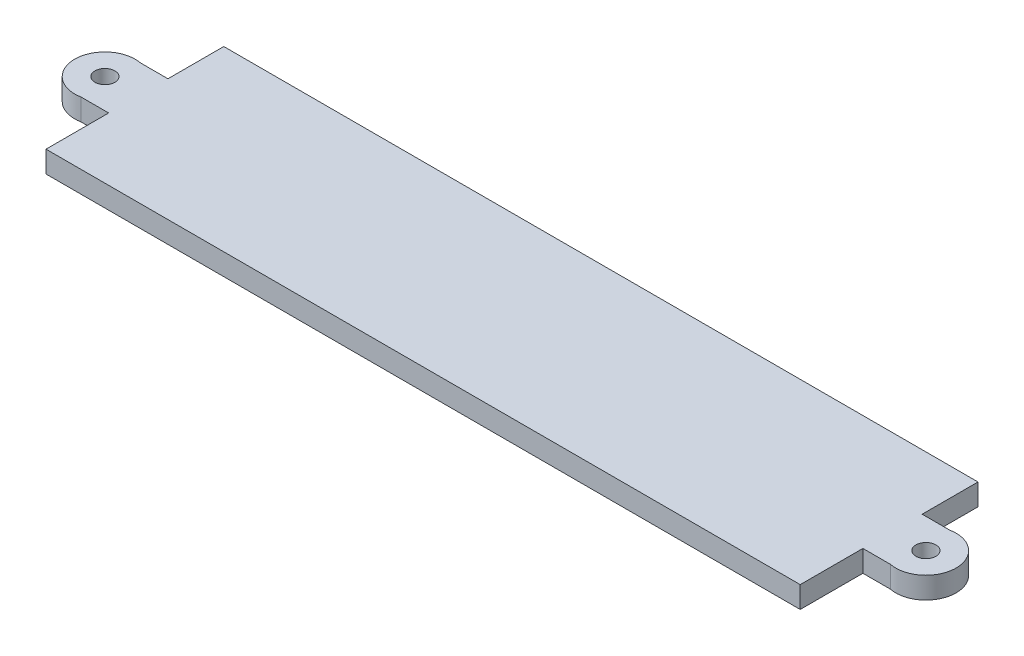
ISO-10303-21;
HEADER;
FILE_DESCRIPTION(('STEP AP214'),'2;1');
FILE_NAME('part.step','',(''),(''),'','','');
FILE_SCHEMA(('AUTOMOTIVE_DESIGN { 1 0 10303 214 1 1 1 1 }'));
ENDSEC;
DATA;
#1=APPLICATION_CONTEXT('core data for automotive mechanical design processes');
#2=APPLICATION_PROTOCOL_DEFINITION('international standard','automotive_design',2000,#1);
#3=PRODUCT_CONTEXT('',#1,'mechanical');
#4=PRODUCT('Part','Part','',(#3));
#5=PRODUCT_RELATED_PRODUCT_CATEGORY('part','',(#4));
#6=PRODUCT_DEFINITION_FORMATION('','',#4);
#7=PRODUCT_DEFINITION_CONTEXT('part definition',#1,'design');
#8=PRODUCT_DEFINITION('design','',#6,#7);
#9=PRODUCT_DEFINITION_SHAPE('','',#8);
#10=(LENGTH_UNIT() NAMED_UNIT(*) SI_UNIT(.MILLI.,.METRE.));
#11=(NAMED_UNIT(*) PLANE_ANGLE_UNIT() SI_UNIT($,.RADIAN.));
#12=(NAMED_UNIT(*) SI_UNIT($,.STERADIAN.) SOLID_ANGLE_UNIT());
#13=UNCERTAINTY_MEASURE_WITH_UNIT(LENGTH_MEASURE(1.E-05),#10,'distance_accuracy_value','');
#14=(GEOMETRIC_REPRESENTATION_CONTEXT(3) GLOBAL_UNCERTAINTY_ASSIGNED_CONTEXT((#13)) GLOBAL_UNIT_ASSIGNED_CONTEXT((#10,
#11,#12)) REPRESENTATION_CONTEXT('',''));
#15=CARTESIAN_POINT('',(0.,0.,0.));
#16=DIRECTION('',(0.,0.,1.));
#17=DIRECTION('',(1.,0.,0.));
#18=AXIS2_PLACEMENT_3D('',#15,#16,#17);
#19=CARTESIAN_POINT('',(0.,5.08,0.));
#20=DIRECTION('',(0.,1.,0.));
#21=DIRECTION('',(0.,0.,1.));
#22=AXIS2_PLACEMENT_3D('',#19,#20,#21);
#23=PLANE('',#22);
#24=CARTESIAN_POINT('',(-78.8273641130957,5.08,8.10690245487701));
#25=DIRECTION('',(0.,1.,0.));
#26=DIRECTION('',(0.,0.,1.));
#27=AXIS2_PLACEMENT_3D('',#24,#25,#26);
#28=CIRCLE('',#27,7.12110493309916);
#29=CARTESIAN_POINT('',(-77.4417557744194,5.08,1.12190245487701));
#30=VERTEX_POINT('',#29);
#31=CARTESIAN_POINT('',(-77.4417557744194,5.08,15.091902454877));
#32=VERTEX_POINT('',#31);
#33=EDGE_CURVE('E83',#30,#32,#28,.T.);
#34=ORIENTED_EDGE('',*,*,#33,.T.);
#35=DIRECTION('',(-1.,0.,0.));
#36=VECTOR('',#35,1.);
#37=CARTESIAN_POINT('',(0.,5.08,15.091902454877));
#38=LINE('',#37,#36);
#39=CARTESIAN_POINT('',(-70.9533641130957,5.08,15.091902454877));
#40=VERTEX_POINT('',#39);
#41=EDGE_CURVE('E128',#40,#32,#38,.T.);
#42=ORIENTED_EDGE('',*,*,#41,.F.);
#43=DIRECTION('',(0.,0.,-1.));
#44=VECTOR('',#43,1.);
#45=CARTESIAN_POINT('',(-70.9533641130957,5.08,0.));
#46=LINE('',#45,#44);
#47=CARTESIAN_POINT('',(-70.9533641130957,5.08,29.8660279689433));
#48=VERTEX_POINT('',#47);
#49=EDGE_CURVE('E122',#48,#40,#46,.T.);
#50=ORIENTED_EDGE('',*,*,#49,.F.);
#51=DIRECTION('',(1.,0.,0.));
#52=VECTOR('',#51,1.);
#53=CARTESIAN_POINT('',(0.,5.08,29.8660279689433));
#54=LINE('',#53,#52);
#55=CARTESIAN_POINT('',(106.846635886904,5.08,29.8660279689433));
#56=VERTEX_POINT('',#55);
#57=EDGE_CURVE('E118',#48,#56,#54,.T.);
#58=ORIENTED_EDGE('',*,*,#57,.T.);
#59=DIRECTION('',(0.,0.,-1.));
#60=VECTOR('',#59,1.);
#61=CARTESIAN_POINT('',(106.846635886904,5.08,0.));
#62=LINE('',#61,#60);
#63=CARTESIAN_POINT('',(106.846635886904,5.08,15.091902454877));
#64=VERTEX_POINT('',#63);
#65=EDGE_CURVE('E178',#56,#64,#62,.T.);
#66=ORIENTED_EDGE('',*,*,#65,.T.);
#67=DIRECTION('',(1.,0.,0.));
#68=VECTOR('',#67,1.);
#69=CARTESIAN_POINT('',(35.8932717738087,5.08,15.091902454877));
#70=LINE('',#69,#68);
#71=CARTESIAN_POINT('',(113.335027548228,5.08,15.091902454877));
#72=VERTEX_POINT('',#71);
#73=EDGE_CURVE('E160',#64,#72,#70,.T.);
#74=ORIENTED_EDGE('',*,*,#73,.T.);
#75=CARTESIAN_POINT('',(114.720635886904,5.08,8.106902454877));
#76=DIRECTION('',(0.,-1.,0.));
#77=DIRECTION('',(0.,0.,1.));
#78=AXIS2_PLACEMENT_3D('',#75,#76,#77);
#79=CIRCLE('',#78,7.12110493309916);
#80=CARTESIAN_POINT('',(113.335027548228,5.08,1.121902454877));
#81=VERTEX_POINT('',#80);
#82=EDGE_CURVE('E164',#81,#72,#79,.T.);
#83=ORIENTED_EDGE('',*,*,#82,.F.);
#84=DIRECTION('',(1.,0.,0.));
#85=VECTOR('',#84,1.);
#86=CARTESIAN_POINT('',(35.8932717738087,5.08,1.121902454877));
#87=LINE('',#86,#85);
#88=CARTESIAN_POINT('',(106.846635886904,5.08,1.121902454877));
#89=VERTEX_POINT('',#88);
#90=EDGE_CURVE('E180',#89,#81,#87,.T.);
#91=ORIENTED_EDGE('',*,*,#90,.F.);
#92=CARTESIAN_POINT('',(106.846635886904,5.08,-12.0439720310567));
#93=VERTEX_POINT('',#92);
#94=EDGE_CURVE('E116',#89,#93,#62,.T.);
#95=ORIENTED_EDGE('',*,*,#94,.T.);
#96=DIRECTION('',(1.,0.,0.));
#97=VECTOR('',#96,1.);
#98=CARTESIAN_POINT('',(0.,5.08,-12.0439720310567));
#99=LINE('',#98,#97);
#100=CARTESIAN_POINT('',(-70.9533641130957,5.08,-12.0439720310567));
#101=VERTEX_POINT('',#100);
#102=EDGE_CURVE('E102',#101,#93,#99,.T.);
#103=ORIENTED_EDGE('',*,*,#102,.F.);
#104=CARTESIAN_POINT('',(-70.9533641130957,5.08,1.12190245487701));
#105=VERTEX_POINT('',#104);
#106=EDGE_CURVE('E113',#105,#101,#46,.T.);
#107=ORIENTED_EDGE('',*,*,#106,.F.);
#108=DIRECTION('',(-1.,0.,0.));
#109=VECTOR('',#108,1.);
#110=CARTESIAN_POINT('',(0.,5.08,1.121902454877));
#111=LINE('',#110,#109);
#112=EDGE_CURVE('E52',#105,#30,#111,.T.);
#113=ORIENTED_EDGE('',*,*,#112,.T.);
#114=EDGE_LOOP('',(#34,#42,#50,#58,#66,#74,#83,#91,#95,#103,#107,#113));
#115=FACE_BOUND('',#114,.T.);
#116=CARTESIAN_POINT('',(-78.8273641130957,5.08,8.10690245487701));
#117=DIRECTION('',(0.,1.,0.));
#118=DIRECTION('',(0.,0.,1.));
#119=AXIS2_PLACEMENT_3D('',#116,#117,#118);
#120=CIRCLE('',#119,2.3495);
#121=CARTESIAN_POINT('',(-78.8273641130957,5.08,10.456402454877));
#122=VERTEX_POINT('',#121);
#123=EDGE_CURVE('E136',#122,#122,#120,.F.);
#124=ORIENTED_EDGE('',*,*,#123,.T.);
#125=EDGE_LOOP('',(#124));
#126=FACE_BOUND('',#125,.T.);
#127=CARTESIAN_POINT('',(114.720635886904,5.08,8.106902454877));
#128=DIRECTION('',(0.,1.,0.));
#129=DIRECTION('',(0.,0.,1.));
#130=AXIS2_PLACEMENT_3D('',#127,#128,#129);
#131=CIRCLE('',#130,2.3495);
#132=CARTESIAN_POINT('',(114.720635886904,5.08,10.456402454877));
#133=VERTEX_POINT('',#132);
#134=EDGE_CURVE('E175',#133,#133,#131,.T.);
#135=ORIENTED_EDGE('',*,*,#134,.F.);
#136=EDGE_LOOP('',(#135));
#137=FACE_BOUND('',#136,.T.);
#138=ADVANCED_FACE('F35',(#115,#126,#137),#23,.T.);
#139=CARTESIAN_POINT('',(0.,0.,0.));
#140=DIRECTION('',(0.,1.,0.));
#141=DIRECTION('',(0.,0.,1.));
#142=AXIS2_PLACEMENT_3D('',#139,#140,#141);
#143=PLANE('',#142);
#144=CARTESIAN_POINT('',(-78.8273641130957,0.,8.10690245487701));
#145=DIRECTION('',(0.,1.,0.));
#146=DIRECTION('',(0.,0.,1.));
#147=AXIS2_PLACEMENT_3D('',#144,#145,#146);
#148=CIRCLE('',#147,7.12110493309916);
#149=CARTESIAN_POINT('',(-77.4417557744194,0.,1.12190245487701));
#150=VERTEX_POINT('',#149);
#151=CARTESIAN_POINT('',(-77.4417557744194,0.,15.091902454877));
#152=VERTEX_POINT('',#151);
#153=EDGE_CURVE('E143',#150,#152,#148,.T.);
#154=ORIENTED_EDGE('',*,*,#153,.F.);
#155=DIRECTION('',(-1.,0.,0.));
#156=VECTOR('',#155,1.);
#157=CARTESIAN_POINT('',(0.,0.,1.121902454877));
#158=LINE('',#157,#156);
#159=CARTESIAN_POINT('',(-70.9533641130957,0.,1.12190245487701));
#160=VERTEX_POINT('',#159);
#161=EDGE_CURVE('E77',#160,#150,#158,.T.);
#162=ORIENTED_EDGE('',*,*,#161,.F.);
#163=DIRECTION('',(0.,0.,-1.));
#164=VECTOR('',#163,1.);
#165=CARTESIAN_POINT('',(-70.9533641130957,0.,0.));
#166=LINE('',#165,#164);
#167=CARTESIAN_POINT('',(-70.9533641130957,0.,-12.0439720310567));
#168=VERTEX_POINT('',#167);
#169=EDGE_CURVE('E248',#160,#168,#166,.T.);
#170=ORIENTED_EDGE('',*,*,#169,.T.);
#171=DIRECTION('',(1.,0.,0.));
#172=VECTOR('',#171,1.);
#173=CARTESIAN_POINT('',(0.,0.,-12.0439720310567));
#174=LINE('',#173,#172);
#175=CARTESIAN_POINT('',(106.846635886904,0.,-12.0439720310567));
#176=VERTEX_POINT('',#175);
#177=EDGE_CURVE('E105',#168,#176,#174,.T.);
#178=ORIENTED_EDGE('',*,*,#177,.T.);
#179=DIRECTION('',(0.,0.,-1.));
#180=VECTOR('',#179,1.);
#181=CARTESIAN_POINT('',(106.846635886904,0.,0.));
#182=LINE('',#181,#180);
#183=CARTESIAN_POINT('',(106.846635886904,0.,1.121902454877));
#184=VERTEX_POINT('',#183);
#185=EDGE_CURVE('E166',#184,#176,#182,.T.);
#186=ORIENTED_EDGE('',*,*,#185,.F.);
#187=DIRECTION('',(1.,0.,0.));
#188=VECTOR('',#187,1.);
#189=CARTESIAN_POINT('',(35.8932717738087,0.,1.121902454877));
#190=LINE('',#189,#188);
#191=CARTESIAN_POINT('',(113.335027548228,0.,1.121902454877));
#192=VERTEX_POINT('',#191);
#193=EDGE_CURVE('E169',#184,#192,#190,.T.);
#194=ORIENTED_EDGE('',*,*,#193,.T.);
#195=CARTESIAN_POINT('',(114.720635886904,0.,8.106902454877));
#196=DIRECTION('',(0.,-1.,0.));
#197=DIRECTION('',(0.,0.,1.));
#198=AXIS2_PLACEMENT_3D('',#195,#196,#197);
#199=CIRCLE('',#198,7.12110493309916);
#200=CARTESIAN_POINT('',(113.335027548228,0.,15.091902454877));
#201=VERTEX_POINT('',#200);
#202=EDGE_CURVE('E172',#192,#201,#199,.T.);
#203=ORIENTED_EDGE('',*,*,#202,.T.);
#204=DIRECTION('',(1.,0.,0.));
#205=VECTOR('',#204,1.);
#206=CARTESIAN_POINT('',(35.8932717738087,0.,15.091902454877));
#207=LINE('',#206,#205);
#208=CARTESIAN_POINT('',(106.846635886904,0.,15.091902454877));
#209=VERTEX_POINT('',#208);
#210=EDGE_CURVE('E161',#209,#201,#207,.T.);
#211=ORIENTED_EDGE('',*,*,#210,.F.);
#212=CARTESIAN_POINT('',(106.846635886904,0.,29.8660279689433));
#213=VERTEX_POINT('',#212);
#214=EDGE_CURVE('E165',#213,#209,#182,.T.);
#215=ORIENTED_EDGE('',*,*,#214,.F.);
#216=DIRECTION('',(1.,0.,0.));
#217=VECTOR('',#216,1.);
#218=CARTESIAN_POINT('',(0.,0.,29.8660279689433));
#219=LINE('',#218,#217);
#220=CARTESIAN_POINT('',(-70.9533641130957,0.,29.8660279689433));
#221=VERTEX_POINT('',#220);
#222=EDGE_CURVE('E246',#221,#213,#219,.T.);
#223=ORIENTED_EDGE('',*,*,#222,.F.);
#224=CARTESIAN_POINT('',(-70.9533641130957,0.,15.091902454877));
#225=VERTEX_POINT('',#224);
#226=EDGE_CURVE('E239',#221,#225,#166,.T.);
#227=ORIENTED_EDGE('',*,*,#226,.T.);
#228=DIRECTION('',(-1.,0.,0.));
#229=VECTOR('',#228,1.);
#230=CARTESIAN_POINT('',(0.,0.,15.091902454877));
#231=LINE('',#230,#229);
#232=EDGE_CURVE('E235',#225,#152,#231,.T.);
#233=ORIENTED_EDGE('',*,*,#232,.T.);
#234=EDGE_LOOP('',(#154,#162,#170,#178,#186,#194,#203,#211,#215,#223,#227,#233));
#235=FACE_BOUND('',#234,.T.);
#236=CARTESIAN_POINT('',(-78.8273641130957,0.,8.10690245487701));
#237=DIRECTION('',(0.,-1.,0.));
#238=DIRECTION('',(0.,0.,-1.));
#239=AXIS2_PLACEMENT_3D('',#236,#237,#238);
#240=CIRCLE('',#239,2.3495);
#241=CARTESIAN_POINT('',(-78.8273641130957,0.,5.75740245487701));
#242=VERTEX_POINT('',#241);
#243=EDGE_CURVE('E139',#242,#242,#240,.T.);
#244=ORIENTED_EDGE('',*,*,#243,.F.);
#245=EDGE_LOOP('',(#244));
#246=FACE_BOUND('',#245,.T.);
#247=CARTESIAN_POINT('',(114.720635886904,0.,8.106902454877));
#248=DIRECTION('',(0.,1.,0.));
#249=DIRECTION('',(0.,0.,-1.));
#250=AXIS2_PLACEMENT_3D('',#247,#248,#249);
#251=CIRCLE('',#250,2.3495);
#252=CARTESIAN_POINT('',(114.720635886904,0.,5.75740245487699));
#253=VERTEX_POINT('',#252);
#254=EDGE_CURVE('E187',#253,#253,#251,.T.);
#255=ORIENTED_EDGE('',*,*,#254,.T.);
#256=EDGE_LOOP('',(#255));
#257=FACE_BOUND('',#256,.T.);
#258=ADVANCED_FACE('F191',(#235,#246,#257),#143,.F.);
#259=CARTESIAN_POINT('',(-78.8273641130957,5.08,8.10690245487701));
#260=DIRECTION('',(0.,-1.,0.));
#261=DIRECTION('',(0.,0.,-1.));
#262=AXIS2_PLACEMENT_3D('',#259,#260,#261);
#263=CYLINDRICAL_SURFACE('',#262,7.12110493309916);
#264=ORIENTED_EDGE('',*,*,#153,.T.);
#265=DIRECTION('',(0.,-1.,0.));
#266=VECTOR('',#265,1.);
#267=CARTESIAN_POINT('',(-77.4417557744194,5.08,15.091902454877));
#268=LINE('',#267,#266);
#269=EDGE_CURVE('E11',#32,#152,#268,.T.);
#270=ORIENTED_EDGE('',*,*,#269,.F.);
#271=ORIENTED_EDGE('',*,*,#33,.F.);
#272=DIRECTION('',(0.,-1.,0.));
#273=VECTOR('',#272,1.);
#274=CARTESIAN_POINT('',(-77.4417557744194,5.08,1.12190245487701));
#275=LINE('',#274,#273);
#276=EDGE_CURVE('E123',#30,#150,#275,.T.);
#277=ORIENTED_EDGE('',*,*,#276,.T.);
#278=EDGE_LOOP('',(#264,#270,#271,#277));
#279=FACE_BOUND('',#278,.T.);
#280=ADVANCED_FACE('F37',(#279),#263,.T.);
#281=CARTESIAN_POINT('',(0.,5.08,15.091902454877));
#282=DIRECTION('',(0.,0.,1.));
#283=DIRECTION('',(1.,0.,0.));
#284=AXIS2_PLACEMENT_3D('',#281,#282,#283);
#285=PLANE('',#284);
#286=ORIENTED_EDGE('',*,*,#232,.F.);
#287=DIRECTION('',(0.,-1.,0.));
#288=VECTOR('',#287,1.);
#289=CARTESIAN_POINT('',(-70.9533641130957,5.08,15.091902454877));
#290=LINE('',#289,#288);
#291=EDGE_CURVE('E44',#40,#225,#290,.T.);
#292=ORIENTED_EDGE('',*,*,#291,.F.);
#293=ORIENTED_EDGE('',*,*,#41,.T.);
#294=ORIENTED_EDGE('',*,*,#269,.T.);
#295=EDGE_LOOP('',(#286,#292,#293,#294));
#296=FACE_BOUND('',#295,.T.);
#297=ADVANCED_FACE('F226',(#296),#285,.T.);
#298=CARTESIAN_POINT('',(-70.9533641130957,5.08,0.));
#299=DIRECTION('',(-1.,0.,0.));
#300=DIRECTION('',(0.,0.,1.));
#301=AXIS2_PLACEMENT_3D('',#298,#299,#300);
#302=PLANE('',#301);
#303=ORIENTED_EDGE('',*,*,#226,.F.);
#304=DIRECTION('',(0.,-1.,0.));
#305=VECTOR('',#304,1.);
#306=CARTESIAN_POINT('',(-70.9533641130957,5.08,29.8660279689433));
#307=LINE('',#306,#305);
#308=EDGE_CURVE('E110',#48,#221,#307,.T.);
#309=ORIENTED_EDGE('',*,*,#308,.F.);
#310=ORIENTED_EDGE('',*,*,#49,.T.);
#311=ORIENTED_EDGE('',*,*,#291,.T.);
#312=EDGE_LOOP('',(#303,#309,#310,#311));
#313=FACE_BOUND('',#312,.T.);
#314=ADVANCED_FACE('F220',(#313),#302,.T.);
#315=CARTESIAN_POINT('',(0.,5.08,29.8660279689433));
#316=DIRECTION('',(0.,0.,-1.));
#317=DIRECTION('',(-1.,0.,0.));
#318=AXIS2_PLACEMENT_3D('',#315,#316,#317);
#319=PLANE('',#318);
#320=ORIENTED_EDGE('',*,*,#222,.T.);
#321=DIRECTION('',(0.,-1.,0.));
#322=VECTOR('',#321,1.);
#323=CARTESIAN_POINT('',(106.846635886904,5.08,29.8660279689433));
#324=LINE('',#323,#322);
#325=EDGE_CURVE('E151',#56,#213,#324,.T.);
#326=ORIENTED_EDGE('',*,*,#325,.F.);
#327=ORIENTED_EDGE('',*,*,#57,.F.);
#328=ORIENTED_EDGE('',*,*,#308,.T.);
#329=EDGE_LOOP('',(#320,#326,#327,#328));
#330=FACE_BOUND('',#329,.T.);
#331=ADVANCED_FACE('F223',(#330),#319,.F.);
#332=CARTESIAN_POINT('',(0.,5.08,-12.0439720310567));
#333=DIRECTION('',(0.,0.,-1.));
#334=DIRECTION('',(-1.,0.,0.));
#335=AXIS2_PLACEMENT_3D('',#332,#333,#334);
#336=PLANE('',#335);
#337=ORIENTED_EDGE('',*,*,#177,.F.);
#338=DIRECTION('',(0.,-1.,0.));
#339=VECTOR('',#338,1.);
#340=CARTESIAN_POINT('',(-70.9533641130957,5.08,-12.0439720310567));
#341=LINE('',#340,#339);
#342=EDGE_CURVE('E97',#101,#168,#341,.T.);
#343=ORIENTED_EDGE('',*,*,#342,.F.);
#344=ORIENTED_EDGE('',*,*,#102,.T.);
#345=DIRECTION('',(0.,-1.,0.));
#346=VECTOR('',#345,1.);
#347=CARTESIAN_POINT('',(106.846635886904,5.08,-12.0439720310567));
#348=LINE('',#347,#346);
#349=EDGE_CURVE('E149',#93,#176,#348,.T.);
#350=ORIENTED_EDGE('',*,*,#349,.T.);
#351=EDGE_LOOP('',(#337,#343,#344,#350));
#352=FACE_BOUND('',#351,.T.);
#353=ADVANCED_FACE('F99',(#352),#336,.T.);
#354=ORIENTED_EDGE('',*,*,#169,.F.);
#355=DIRECTION('',(0.,-1.,0.));
#356=VECTOR('',#355,1.);
#357=CARTESIAN_POINT('',(-70.9533641130957,5.08,1.12190245487701));
#358=LINE('',#357,#356);
#359=EDGE_CURVE('E74',#105,#160,#358,.T.);
#360=ORIENTED_EDGE('',*,*,#359,.F.);
#361=ORIENTED_EDGE('',*,*,#106,.T.);
#362=ORIENTED_EDGE('',*,*,#342,.T.);
#363=EDGE_LOOP('',(#354,#360,#361,#362));
#364=FACE_BOUND('',#363,.T.);
#365=ADVANCED_FACE('F120',(#364),#302,.T.);
#366=CARTESIAN_POINT('',(0.,5.08,1.121902454877));
#367=DIRECTION('',(0.,0.,1.));
#368=DIRECTION('',(1.,0.,0.));
#369=AXIS2_PLACEMENT_3D('',#366,#367,#368);
#370=PLANE('',#369);
#371=ORIENTED_EDGE('',*,*,#161,.T.);
#372=ORIENTED_EDGE('',*,*,#276,.F.);
#373=ORIENTED_EDGE('',*,*,#112,.F.);
#374=ORIENTED_EDGE('',*,*,#359,.T.);
#375=EDGE_LOOP('',(#371,#372,#373,#374));
#376=FACE_BOUND('',#375,.T.);
#377=ADVANCED_FACE('F215',(#376),#370,.F.);
#378=CARTESIAN_POINT('',(-78.8273641130957,5.081,8.10690245487701));
#379=DIRECTION('',(0.,-1.,0.));
#380=DIRECTION('',(0.,0.,-1.));
#381=AXIS2_PLACEMENT_3D('',#378,#379,#380);
#382=CYLINDRICAL_SURFACE('',#381,2.3495);
#383=ORIENTED_EDGE('',*,*,#123,.F.);
#384=EDGE_LOOP('',(#383));
#385=FACE_BOUND('',#384,.T.);
#386=ORIENTED_EDGE('',*,*,#243,.T.);
#387=EDGE_LOOP('',(#386));
#388=FACE_BOUND('',#387,.T.);
#389=ADVANCED_FACE('F212',(#385,#388),#382,.F.);
#390=CARTESIAN_POINT('',(114.720635886904,5.08,8.106902454877));
#391=DIRECTION('',(0.,-1.,0.));
#392=DIRECTION('',(0.,0.,-1.));
#393=AXIS2_PLACEMENT_3D('',#390,#391,#392);
#394=CYLINDRICAL_SURFACE('',#393,7.12110493309916);
#395=ORIENTED_EDGE('',*,*,#202,.F.);
#396=DIRECTION('',(0.,-1.,0.));
#397=VECTOR('',#396,1.);
#398=CARTESIAN_POINT('',(113.335027548228,5.08,1.121902454877));
#399=LINE('',#398,#397);
#400=EDGE_CURVE('E140',#81,#192,#399,.T.);
#401=ORIENTED_EDGE('',*,*,#400,.F.);
#402=ORIENTED_EDGE('',*,*,#82,.T.);
#403=DIRECTION('',(0.,-1.,0.));
#404=VECTOR('',#403,1.);
#405=CARTESIAN_POINT('',(113.335027548228,5.08,15.091902454877));
#406=LINE('',#405,#404);
#407=EDGE_CURVE('E157',#72,#201,#406,.T.);
#408=ORIENTED_EDGE('',*,*,#407,.T.);
#409=EDGE_LOOP('',(#395,#401,#402,#408));
#410=FACE_BOUND('',#409,.T.);
#411=ADVANCED_FACE('F294',(#410),#394,.T.);
#412=CARTESIAN_POINT('',(35.8932717738087,5.08,1.121902454877));
#413=DIRECTION('',(0.,0.,-1.));
#414=DIRECTION('',(-1.,0.,0.));
#415=AXIS2_PLACEMENT_3D('',#412,#413,#414);
#416=PLANE('',#415);
#417=ORIENTED_EDGE('',*,*,#193,.F.);
#418=DIRECTION('',(0.,-1.,0.));
#419=VECTOR('',#418,1.);
#420=CARTESIAN_POINT('',(106.846635886904,5.08,1.121902454877));
#421=LINE('',#420,#419);
#422=EDGE_CURVE('E146',#89,#184,#421,.T.);
#423=ORIENTED_EDGE('',*,*,#422,.F.);
#424=ORIENTED_EDGE('',*,*,#90,.T.);
#425=ORIENTED_EDGE('',*,*,#400,.T.);
#426=EDGE_LOOP('',(#417,#423,#424,#425));
#427=FACE_BOUND('',#426,.T.);
#428=ADVANCED_FACE('F290',(#427),#416,.T.);
#429=CARTESIAN_POINT('',(106.846635886904,5.08,0.));
#430=DIRECTION('',(-1.,0.,0.));
#431=DIRECTION('',(0.,0.,1.));
#432=AXIS2_PLACEMENT_3D('',#429,#430,#431);
#433=PLANE('',#432);
#434=ORIENTED_EDGE('',*,*,#185,.T.);
#435=ORIENTED_EDGE('',*,*,#349,.F.);
#436=ORIENTED_EDGE('',*,*,#94,.F.);
#437=ORIENTED_EDGE('',*,*,#422,.T.);
#438=EDGE_LOOP('',(#434,#435,#436,#437));
#439=FACE_BOUND('',#438,.T.);
#440=ADVANCED_FACE('F292',(#439),#433,.F.);
#441=ORIENTED_EDGE('',*,*,#214,.T.);
#442=DIRECTION('',(0.,-1.,0.));
#443=VECTOR('',#442,1.);
#444=CARTESIAN_POINT('',(106.846635886904,5.08,15.091902454877));
#445=LINE('',#444,#443);
#446=EDGE_CURVE('E154',#64,#209,#445,.T.);
#447=ORIENTED_EDGE('',*,*,#446,.F.);
#448=ORIENTED_EDGE('',*,*,#65,.F.);
#449=ORIENTED_EDGE('',*,*,#325,.T.);
#450=EDGE_LOOP('',(#441,#447,#448,#449));
#451=FACE_BOUND('',#450,.T.);
#452=ADVANCED_FACE('F201',(#451),#433,.F.);
#453=CARTESIAN_POINT('',(35.8932717738087,5.08,15.091902454877));
#454=DIRECTION('',(0.,0.,-1.));
#455=DIRECTION('',(-1.,0.,0.));
#456=AXIS2_PLACEMENT_3D('',#453,#454,#455);
#457=PLANE('',#456);
#458=ORIENTED_EDGE('',*,*,#210,.T.);
#459=ORIENTED_EDGE('',*,*,#407,.F.);
#460=ORIENTED_EDGE('',*,*,#73,.F.);
#461=ORIENTED_EDGE('',*,*,#446,.T.);
#462=EDGE_LOOP('',(#458,#459,#460,#461));
#463=FACE_BOUND('',#462,.T.);
#464=ADVANCED_FACE('F195',(#463),#457,.F.);
#465=CARTESIAN_POINT('',(114.720635886904,5.081,8.106902454877));
#466=DIRECTION('',(0.,-1.,0.));
#467=DIRECTION('',(0.,0.,-1.));
#468=AXIS2_PLACEMENT_3D('',#465,#466,#467);
#469=CYLINDRICAL_SURFACE('',#468,2.3495);
#470=ORIENTED_EDGE('',*,*,#134,.T.);
#471=EDGE_LOOP('',(#470));
#472=FACE_BOUND('',#471,.T.);
#473=ORIENTED_EDGE('',*,*,#254,.F.);
#474=EDGE_LOOP('',(#473));
#475=FACE_BOUND('',#474,.T.);
#476=ADVANCED_FACE('F193',(#472,#475),#469,.F.);
#477=CLOSED_SHELL('',(#138,#258,#280,#297,#314,#331,#353,#365,#377,#389,#411,#428,#440,#452,
#464,#476));
#478=MANIFOLD_SOLID_BREP('B2',#477);
#479=ADVANCED_BREP_SHAPE_REPRESENTATION('',(#18,#478),#14);
#480=SHAPE_DEFINITION_REPRESENTATION(#9,#479);
ENDSEC;
END-ISO-10303-21;
